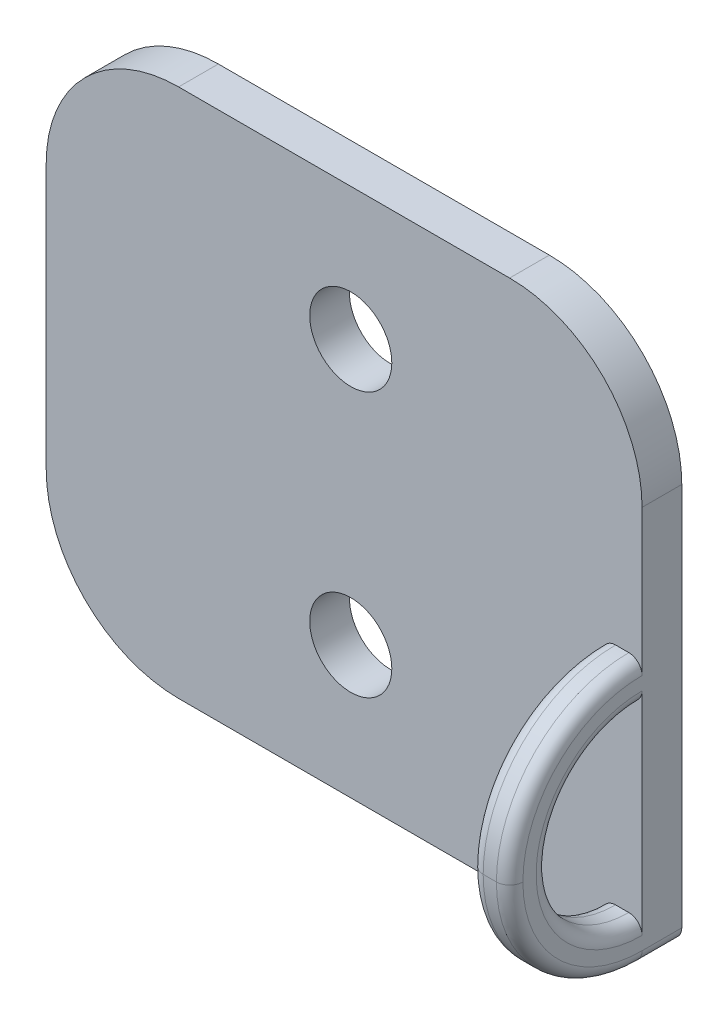
ISO-10303-21;
HEADER;
FILE_DESCRIPTION(('STEP AP214'),'2;1');
FILE_NAME('part.step','',(''),(''),'','','');
FILE_SCHEMA(('AUTOMOTIVE_DESIGN { 1 0 10303 214 1 1 1 1 }'));
ENDSEC;
DATA;
#1=APPLICATION_CONTEXT('core data for automotive mechanical design processes');
#2=APPLICATION_PROTOCOL_DEFINITION('international standard','automotive_design',2000,#1);
#3=PRODUCT_CONTEXT('',#1,'mechanical');
#4=PRODUCT('Part','Part','',(#3));
#5=PRODUCT_RELATED_PRODUCT_CATEGORY('part','',(#4));
#6=PRODUCT_DEFINITION_FORMATION('','',#4);
#7=PRODUCT_DEFINITION_CONTEXT('part definition',#1,'design');
#8=PRODUCT_DEFINITION('design','',#6,#7);
#9=PRODUCT_DEFINITION_SHAPE('','',#8);
#10=(LENGTH_UNIT() NAMED_UNIT(*) SI_UNIT(.MILLI.,.METRE.));
#11=(NAMED_UNIT(*) PLANE_ANGLE_UNIT() SI_UNIT($,.RADIAN.));
#12=(NAMED_UNIT(*) SI_UNIT($,.STERADIAN.) SOLID_ANGLE_UNIT());
#13=UNCERTAINTY_MEASURE_WITH_UNIT(LENGTH_MEASURE(1.E-05),#10,'distance_accuracy_value','');
#14=(GEOMETRIC_REPRESENTATION_CONTEXT(3) GLOBAL_UNCERTAINTY_ASSIGNED_CONTEXT((#13)) GLOBAL_UNIT_ASSIGNED_CONTEXT((#10,
#11,#12)) REPRESENTATION_CONTEXT('',''));
#15=CARTESIAN_POINT('',(0.,0.,0.));
#16=DIRECTION('',(0.,0.,1.));
#17=DIRECTION('',(1.,0.,0.));
#18=AXIS2_PLACEMENT_3D('',#15,#16,#17);
#19=CARTESIAN_POINT('',(35.,30.,3.));
#20=DIRECTION('',(0.,0.,-1.));
#21=DIRECTION('',(-1.,0.,0.));
#22=AXIS2_PLACEMENT_3D('',#19,#20,#21);
#23=PLANE('',#22);
#24=CARTESIAN_POINT('',(23.,10.,3.));
#25=DIRECTION('',(0.,0.,1.));
#26=DIRECTION('',(1.,0.,0.));
#27=AXIS2_PLACEMENT_3D('',#24,#25,#26);
#28=CIRCLE('',#27,3.1);
#29=CARTESIAN_POINT('',(26.1,10.,3.));
#30=VERTEX_POINT('',#29);
#31=EDGE_CURVE('E256',#30,#30,#28,.T.);
#32=ORIENTED_EDGE('',*,*,#31,.F.);
#33=EDGE_LOOP('',(#32));
#34=FACE_BOUND('',#33,.T.);
#35=CARTESIAN_POINT('',(23.,30.,3.));
#36=DIRECTION('',(0.,0.,1.));
#37=DIRECTION('',(1.,0.,0.));
#38=AXIS2_PLACEMENT_3D('',#35,#36,#37);
#39=CIRCLE('',#38,3.1);
#40=CARTESIAN_POINT('',(26.1,30.,3.));
#41=VERTEX_POINT('',#40);
#42=EDGE_CURVE('E263',#41,#41,#39,.T.);
#43=ORIENTED_EDGE('',*,*,#42,.F.);
#44=EDGE_LOOP('',(#43));
#45=FACE_BOUND('',#44,.T.);
#46=DIRECTION('',(0.,-1.,0.));
#47=VECTOR('',#46,1.);
#48=CARTESIAN_POINT('',(42.,0.,3.));
#49=LINE('',#48,#47);
#50=CARTESIAN_POINT('',(42.,19.,3.));
#51=VERTEX_POINT('',#50);
#52=CARTESIAN_POINT('',(42.,18.,3.));
#53=VERTEX_POINT('',#52);
#54=EDGE_CURVE('E255',#51,#53,#49,.T.);
#55=ORIENTED_EDGE('',*,*,#54,.F.);
#56=CARTESIAN_POINT('',(43.,19.,3.));
#57=DIRECTION('',(0.,0.,-1.));
#58=DIRECTION('',(-1.,0.,0.));
#59=AXIS2_PLACEMENT_3D('',#56,#57,#58);
#60=CIRCLE('',#59,1.);
#61=CARTESIAN_POINT('',(43.,20.,3.));
#62=VERTEX_POINT('',#61);
#63=EDGE_CURVE('E55',#51,#62,#60,.T.);
#64=ORIENTED_EDGE('',*,*,#63,.T.);
#65=DIRECTION('',(-1.,0.,0.));
#66=VECTOR('',#65,1.);
#67=CARTESIAN_POINT('',(45.,20.,3.));
#68=LINE('',#67,#66);
#69=CARTESIAN_POINT('',(44.,20.,3.));
#70=VERTEX_POINT('',#69);
#71=EDGE_CURVE('E189',#70,#62,#68,.T.);
#72=ORIENTED_EDGE('',*,*,#71,.F.);
#73=CARTESIAN_POINT('',(44.,19.,3.));
#74=DIRECTION('',(0.,0.,-1.));
#75=DIRECTION('',(-1.,0.,0.));
#76=AXIS2_PLACEMENT_3D('',#73,#74,#75);
#77=CIRCLE('',#76,1.);
#78=CARTESIAN_POINT('',(45.,19.,3.));
#79=VERTEX_POINT('',#78);
#80=EDGE_CURVE('E157',#70,#79,#77,.T.);
#81=ORIENTED_EDGE('',*,*,#80,.T.);
#82=DIRECTION('',(0.,1.,0.));
#83=VECTOR('',#82,1.);
#84=CARTESIAN_POINT('',(45.,0.,3.));
#85=LINE('',#84,#83);
#86=CARTESIAN_POINT('',(45.,29.9999999999999,3.));
#87=VERTEX_POINT('',#86);
#88=EDGE_CURVE('E152',#79,#87,#85,.T.);
#89=ORIENTED_EDGE('',*,*,#88,.T.);
#90=CARTESIAN_POINT('',(35.,30.,3.));
#91=DIRECTION('',(0.,0.,1.));
#92=DIRECTION('',(-1.,0.,0.));
#93=AXIS2_PLACEMENT_3D('',#90,#91,#92);
#94=CIRCLE('',#93,10.);
#95=CARTESIAN_POINT('',(34.9999999999999,40.,3.));
#96=VERTEX_POINT('',#95);
#97=EDGE_CURVE('E154',#87,#96,#94,.T.);
#98=ORIENTED_EDGE('',*,*,#97,.T.);
#99=DIRECTION('',(-1.,0.,0.));
#100=VECTOR('',#99,1.);
#101=CARTESIAN_POINT('',(10.0000000000001,40.,3.));
#102=LINE('',#101,#100);
#103=CARTESIAN_POINT('',(10.0000000000001,40.,3.));
#104=VERTEX_POINT('',#103);
#105=EDGE_CURVE('E170',#96,#104,#102,.T.);
#106=ORIENTED_EDGE('',*,*,#105,.T.);
#107=CARTESIAN_POINT('',(10.,30.,3.));
#108=DIRECTION('',(0.,0.,1.));
#109=DIRECTION('',(-1.,0.,0.));
#110=AXIS2_PLACEMENT_3D('',#107,#108,#109);
#111=CIRCLE('',#110,10.);
#112=CARTESIAN_POINT('',(0.,29.9999999999999,3.));
#113=VERTEX_POINT('',#112);
#114=EDGE_CURVE('E269',#104,#113,#111,.T.);
#115=ORIENTED_EDGE('',*,*,#114,.T.);
#116=DIRECTION('',(0.,-1.,0.));
#117=VECTOR('',#116,1.);
#118=CARTESIAN_POINT('',(0.,10.0000000000001,3.));
#119=LINE('',#118,#117);
#120=CARTESIAN_POINT('',(0.,10.,3.));
#121=VERTEX_POINT('',#120);
#122=EDGE_CURVE('E271',#113,#121,#119,.T.);
#123=ORIENTED_EDGE('',*,*,#122,.T.);
#124=CARTESIAN_POINT('',(10.,10.,3.));
#125=DIRECTION('',(0.,0.,1.));
#126=DIRECTION('',(-1.,0.,0.));
#127=AXIS2_PLACEMENT_3D('',#124,#125,#126);
#128=CIRCLE('',#127,10.);
#129=CARTESIAN_POINT('',(10.0000000000001,0.,3.));
#130=VERTEX_POINT('',#129);
#131=EDGE_CURVE('E273',#121,#130,#128,.T.);
#132=ORIENTED_EDGE('',*,*,#131,.T.);
#133=DIRECTION('',(1.,0.,0.));
#134=VECTOR('',#133,1.);
#135=CARTESIAN_POINT('',(10.0000000000001,0.,3.));
#136=LINE('',#135,#134);
#137=CARTESIAN_POINT('',(43.,0.,3.));
#138=VERTEX_POINT('',#137);
#139=EDGE_CURVE('E275',#130,#138,#136,.T.);
#140=ORIENTED_EDGE('',*,*,#139,.T.);
#141=CARTESIAN_POINT('',(43.,0.999999999999999,3.));
#142=DIRECTION('',(0.,0.,-1.));
#143=DIRECTION('',(-1.,0.,0.));
#144=AXIS2_PLACEMENT_3D('',#141,#142,#143);
#145=CIRCLE('',#144,1.);
#146=CARTESIAN_POINT('',(42.,0.999999999999999,3.));
#147=VERTEX_POINT('',#146);
#148=EDGE_CURVE('E224',#138,#147,#145,.T.);
#149=ORIENTED_EDGE('',*,*,#148,.T.);
#150=CARTESIAN_POINT('',(42.,2.,3.));
#151=VERTEX_POINT('',#150);
#152=EDGE_CURVE('E252',#151,#147,#49,.T.);
#153=ORIENTED_EDGE('',*,*,#152,.F.);
#154=CARTESIAN_POINT('',(43.,2.,3.));
#155=DIRECTION('',(0.,0.,-1.));
#156=DIRECTION('',(-1.,0.,0.));
#157=AXIS2_PLACEMENT_3D('',#154,#155,#156);
#158=CIRCLE('',#157,1.);
#159=CARTESIAN_POINT('',(43.,3.,3.));
#160=VERTEX_POINT('',#159);
#161=EDGE_CURVE('E11',#151,#160,#158,.T.);
#162=ORIENTED_EDGE('',*,*,#161,.T.);
#163=DIRECTION('',(-1.,0.,0.));
#164=VECTOR('',#163,1.);
#165=CARTESIAN_POINT('',(45.,3.,3.));
#166=LINE('',#165,#164);
#167=CARTESIAN_POINT('',(44.,3.,3.));
#168=VERTEX_POINT('',#167);
#169=EDGE_CURVE('E190',#168,#160,#166,.T.);
#170=ORIENTED_EDGE('',*,*,#169,.F.);
#171=CARTESIAN_POINT('',(44.,2.,3.));
#172=DIRECTION('',(0.,0.,-1.));
#173=DIRECTION('',(-1.,0.,0.));
#174=AXIS2_PLACEMENT_3D('',#171,#172,#173);
#175=CIRCLE('',#174,1.);
#176=CARTESIAN_POINT('',(45.,2.,3.));
#177=VERTEX_POINT('',#176);
#178=EDGE_CURVE('E228',#168,#177,#175,.T.);
#179=ORIENTED_EDGE('',*,*,#178,.T.);
#180=DIRECTION('',(0.,-1.,0.));
#181=VECTOR('',#180,1.);
#182=CARTESIAN_POINT('',(45.,17.,3.));
#183=LINE('',#182,#181);
#184=CARTESIAN_POINT('',(45.,18.,3.));
#185=VERTEX_POINT('',#184);
#186=EDGE_CURVE('E238',#185,#177,#183,.T.);
#187=ORIENTED_EDGE('',*,*,#186,.F.);
#188=CARTESIAN_POINT('',(44.,18.,3.));
#189=DIRECTION('',(0.,0.,-1.));
#190=DIRECTION('',(-1.,0.,0.));
#191=AXIS2_PLACEMENT_3D('',#188,#189,#190);
#192=CIRCLE('',#191,1.);
#193=CARTESIAN_POINT('',(44.,17.,3.));
#194=VERTEX_POINT('',#193);
#195=EDGE_CURVE('E226',#185,#194,#192,.T.);
#196=ORIENTED_EDGE('',*,*,#195,.T.);
#197=DIRECTION('',(-1.,0.,0.));
#198=VECTOR('',#197,1.);
#199=CARTESIAN_POINT('',(45.,17.,3.));
#200=LINE('',#199,#198);
#201=CARTESIAN_POINT('',(43.,17.,3.));
#202=VERTEX_POINT('',#201);
#203=EDGE_CURVE('E243',#194,#202,#200,.T.);
#204=ORIENTED_EDGE('',*,*,#203,.T.);
#205=CARTESIAN_POINT('',(43.,18.,3.));
#206=DIRECTION('',(0.,0.,-1.));
#207=DIRECTION('',(-1.,0.,0.));
#208=AXIS2_PLACEMENT_3D('',#205,#206,#207);
#209=CIRCLE('',#208,1.);
#210=EDGE_CURVE('E47',#202,#53,#209,.T.);
#211=ORIENTED_EDGE('',*,*,#210,.T.);
#212=EDGE_LOOP('',(#55,#64,#72,#81,#89,#98,#106,#115,#123,#132,#140,#149,#153,#162,#170,#179,
#187,#196,#204,#211));
#213=FACE_BOUND('',#212,.T.);
#214=ADVANCED_FACE('F37',(#34,#45,#213),#23,.F.);
#215=CARTESIAN_POINT('',(35.,30.,0.));
#216=DIRECTION('',(0.,0.,-1.));
#217=DIRECTION('',(-1.,0.,0.));
#218=AXIS2_PLACEMENT_3D('',#215,#216,#217);
#219=PLANE('',#218);
#220=CARTESIAN_POINT('',(23.,30.,0.));
#221=DIRECTION('',(0.,0.,1.));
#222=DIRECTION('',(1.,0.,0.));
#223=AXIS2_PLACEMENT_3D('',#220,#221,#222);
#224=CIRCLE('',#223,3.1);
#225=CARTESIAN_POINT('',(26.1,30.,0.));
#226=VERTEX_POINT('',#225);
#227=EDGE_CURVE('E259',#226,#226,#224,.T.);
#228=ORIENTED_EDGE('',*,*,#227,.T.);
#229=EDGE_LOOP('',(#228));
#230=FACE_BOUND('',#229,.T.);
#231=DIRECTION('',(0.,1.,0.));
#232=VECTOR('',#231,1.);
#233=CARTESIAN_POINT('',(45.,0.,0.));
#234=LINE('',#233,#232);
#235=CARTESIAN_POINT('',(45.,1.,0.));
#236=VERTEX_POINT('',#235);
#237=CARTESIAN_POINT('',(45.,29.9999999999999,0.));
#238=VERTEX_POINT('',#237);
#239=EDGE_CURVE('E175',#236,#238,#234,.T.);
#240=ORIENTED_EDGE('',*,*,#239,.F.);
#241=CARTESIAN_POINT('',(44.,1.,0.));
#242=DIRECTION('',(0.,0.,-1.));
#243=DIRECTION('',(-1.,0.,0.));
#244=AXIS2_PLACEMENT_3D('',#241,#242,#243);
#245=CIRCLE('',#244,1.);
#246=CARTESIAN_POINT('',(44.,0.,0.));
#247=VERTEX_POINT('',#246);
#248=EDGE_CURVE('E199',#236,#247,#245,.T.);
#249=ORIENTED_EDGE('',*,*,#248,.T.);
#250=DIRECTION('',(1.,0.,0.));
#251=VECTOR('',#250,1.);
#252=CARTESIAN_POINT('',(10.0000000000001,0.,0.));
#253=LINE('',#252,#251);
#254=CARTESIAN_POINT('',(10.0000000000001,0.,0.));
#255=VERTEX_POINT('',#254);
#256=EDGE_CURVE('E161',#255,#247,#253,.T.);
#257=ORIENTED_EDGE('',*,*,#256,.F.);
#258=CARTESIAN_POINT('',(10.,10.,0.));
#259=DIRECTION('',(0.,0.,1.));
#260=DIRECTION('',(-1.,0.,0.));
#261=AXIS2_PLACEMENT_3D('',#258,#259,#260);
#262=CIRCLE('',#261,10.);
#263=CARTESIAN_POINT('',(0.,10.,0.));
#264=VERTEX_POINT('',#263);
#265=EDGE_CURVE('E288',#264,#255,#262,.T.);
#266=ORIENTED_EDGE('',*,*,#265,.F.);
#267=DIRECTION('',(0.,-1.,0.));
#268=VECTOR('',#267,1.);
#269=CARTESIAN_POINT('',(0.,10.0000000000001,0.));
#270=LINE('',#269,#268);
#271=CARTESIAN_POINT('',(0.,29.9999999999999,0.));
#272=VERTEX_POINT('',#271);
#273=EDGE_CURVE('E286',#272,#264,#270,.T.);
#274=ORIENTED_EDGE('',*,*,#273,.F.);
#275=CARTESIAN_POINT('',(10.,30.,0.));
#276=DIRECTION('',(0.,0.,1.));
#277=DIRECTION('',(-1.,0.,0.));
#278=AXIS2_PLACEMENT_3D('',#275,#276,#277);
#279=CIRCLE('',#278,10.);
#280=CARTESIAN_POINT('',(10.0000000000001,40.,0.));
#281=VERTEX_POINT('',#280);
#282=EDGE_CURVE('E284',#281,#272,#279,.T.);
#283=ORIENTED_EDGE('',*,*,#282,.F.);
#284=DIRECTION('',(-1.,0.,0.));
#285=VECTOR('',#284,1.);
#286=CARTESIAN_POINT('',(10.0000000000001,40.,0.));
#287=LINE('',#286,#285);
#288=CARTESIAN_POINT('',(34.9999999999999,40.,0.));
#289=VERTEX_POINT('',#288);
#290=EDGE_CURVE('E282',#289,#281,#287,.T.);
#291=ORIENTED_EDGE('',*,*,#290,.F.);
#292=CARTESIAN_POINT('',(35.,30.,0.));
#293=DIRECTION('',(0.,0.,1.));
#294=DIRECTION('',(-1.,0.,0.));
#295=AXIS2_PLACEMENT_3D('',#292,#293,#294);
#296=CIRCLE('',#295,10.);
#297=EDGE_CURVE('E280',#238,#289,#296,.T.);
#298=ORIENTED_EDGE('',*,*,#297,.F.);
#299=EDGE_LOOP('',(#240,#249,#257,#266,#274,#283,#291,#298));
#300=FACE_BOUND('',#299,.T.);
#301=CARTESIAN_POINT('',(23.,10.,0.));
#302=DIRECTION('',(0.,0.,1.));
#303=DIRECTION('',(1.,0.,0.));
#304=AXIS2_PLACEMENT_3D('',#301,#302,#303);
#305=CIRCLE('',#304,3.1);
#306=CARTESIAN_POINT('',(26.1,10.,0.));
#307=VERTEX_POINT('',#306);
#308=EDGE_CURVE('E260',#307,#307,#305,.T.);
#309=ORIENTED_EDGE('',*,*,#308,.T.);
#310=EDGE_LOOP('',(#309));
#311=FACE_BOUND('',#310,.T.);
#312=ADVANCED_FACE('F310',(#230,#300,#311),#219,.T.);
#313=CARTESIAN_POINT('',(45.,0.,3.));
#314=DIRECTION('',(-1.,0.,0.));
#315=DIRECTION('',(0.,0.,1.));
#316=AXIS2_PLACEMENT_3D('',#313,#314,#315);
#317=PLANE('',#316);
#318=CARTESIAN_POINT('',(45.,10.,3.));
#319=DIRECTION('',(-1.,0.,0.));
#320=DIRECTION('',(0.,0.,1.));
#321=AXIS2_PLACEMENT_3D('',#318,#319,#320);
#322=CIRCLE('',#321,8.);
#323=EDGE_CURVE('E196',#177,#185,#322,.T.);
#324=ORIENTED_EDGE('',*,*,#323,.T.);
#325=ORIENTED_EDGE('',*,*,#186,.T.);
#326=EDGE_LOOP('',(#324,#325));
#327=FACE_BOUND('',#326,.T.);
#328=CARTESIAN_POINT('',(45.,10.,3.));
#329=DIRECTION('',(-1.,0.,0.));
#330=DIRECTION('',(0.,0.,1.));
#331=AXIS2_PLACEMENT_3D('',#328,#329,#330);
#332=CIRCLE('',#331,9.);
#333=CARTESIAN_POINT('',(45.,10.,12.));
#334=VERTEX_POINT('',#333);
#335=CARTESIAN_POINT('',(45.,1.,3.));
#336=VERTEX_POINT('',#335);
#337=EDGE_CURVE('E192',#334,#336,#332,.F.);
#338=ORIENTED_EDGE('',*,*,#337,.T.);
#339=DIRECTION('',(0.,0.,-1.));
#340=VECTOR('',#339,1.);
#341=CARTESIAN_POINT('',(45.,1.,3.));
#342=LINE('',#341,#340);
#343=EDGE_CURVE('E194',#336,#236,#342,.T.);
#344=ORIENTED_EDGE('',*,*,#343,.T.);
#345=ORIENTED_EDGE('',*,*,#239,.T.);
#346=DIRECTION('',(0.,0.,-1.));
#347=VECTOR('',#346,1.);
#348=CARTESIAN_POINT('',(45.,29.9999999999999,3.));
#349=LINE('',#348,#347);
#350=EDGE_CURVE('E166',#87,#238,#349,.T.);
#351=ORIENTED_EDGE('',*,*,#350,.F.);
#352=ORIENTED_EDGE('',*,*,#88,.F.);
#353=CARTESIAN_POINT('',(45.,10.,3.));
#354=DIRECTION('',(-1.,0.,0.));
#355=DIRECTION('',(0.,0.,1.));
#356=AXIS2_PLACEMENT_3D('',#353,#354,#355);
#357=CIRCLE('',#356,9.);
#358=EDGE_CURVE('E180',#79,#334,#357,.F.);
#359=ORIENTED_EDGE('',*,*,#358,.T.);
#360=EDGE_LOOP('',(#338,#344,#345,#351,#352,#359));
#361=FACE_BOUND('',#360,.T.);
#362=ADVANCED_FACE('F172',(#327,#361),#317,.F.);
#363=CARTESIAN_POINT('',(35.,30.,3.));
#364=DIRECTION('',(0.,0.,-1.));
#365=DIRECTION('',(-1.,0.,0.));
#366=AXIS2_PLACEMENT_3D('',#363,#364,#365);
#367=CYLINDRICAL_SURFACE('',#366,10.);
#368=ORIENTED_EDGE('',*,*,#297,.T.);
#369=DIRECTION('',(0.,0.,-1.));
#370=VECTOR('',#369,1.);
#371=CARTESIAN_POINT('',(34.9999999999999,40.,3.));
#372=LINE('',#371,#370);
#373=EDGE_CURVE('E168',#96,#289,#372,.T.);
#374=ORIENTED_EDGE('',*,*,#373,.F.);
#375=ORIENTED_EDGE('',*,*,#97,.F.);
#376=ORIENTED_EDGE('',*,*,#350,.T.);
#377=EDGE_LOOP('',(#368,#374,#375,#376));
#378=FACE_BOUND('',#377,.T.);
#379=ADVANCED_FACE('F165',(#378),#367,.T.);
#380=CARTESIAN_POINT('',(10.0000000000001,40.,3.));
#381=DIRECTION('',(0.,-1.,0.));
#382=DIRECTION('',(0.,0.,-1.));
#383=AXIS2_PLACEMENT_3D('',#380,#381,#382);
#384=PLANE('',#383);
#385=ORIENTED_EDGE('',*,*,#290,.T.);
#386=DIRECTION('',(0.,0.,-1.));
#387=VECTOR('',#386,1.);
#388=CARTESIAN_POINT('',(10.0000000000001,40.,3.));
#389=LINE('',#388,#387);
#390=EDGE_CURVE('E182',#104,#281,#389,.T.);
#391=ORIENTED_EDGE('',*,*,#390,.F.);
#392=ORIENTED_EDGE('',*,*,#105,.F.);
#393=ORIENTED_EDGE('',*,*,#373,.T.);
#394=EDGE_LOOP('',(#385,#391,#392,#393));
#395=FACE_BOUND('',#394,.T.);
#396=ADVANCED_FACE('F323',(#395),#384,.F.);
#397=CARTESIAN_POINT('',(10.,30.,3.));
#398=DIRECTION('',(0.,0.,-1.));
#399=DIRECTION('',(-1.,0.,0.));
#400=AXIS2_PLACEMENT_3D('',#397,#398,#399);
#401=CYLINDRICAL_SURFACE('',#400,10.);
#402=ORIENTED_EDGE('',*,*,#282,.T.);
#403=DIRECTION('',(0.,0.,-1.));
#404=VECTOR('',#403,1.);
#405=CARTESIAN_POINT('',(0.,29.9999999999999,3.));
#406=LINE('',#405,#404);
#407=EDGE_CURVE('E297',#113,#272,#406,.T.);
#408=ORIENTED_EDGE('',*,*,#407,.F.);
#409=ORIENTED_EDGE('',*,*,#114,.F.);
#410=ORIENTED_EDGE('',*,*,#390,.T.);
#411=EDGE_LOOP('',(#402,#408,#409,#410));
#412=FACE_BOUND('',#411,.T.);
#413=ADVANCED_FACE('F304',(#412),#401,.T.);
#414=CARTESIAN_POINT('',(0.,10.0000000000001,3.));
#415=DIRECTION('',(1.,0.,0.));
#416=DIRECTION('',(0.,0.,-1.));
#417=AXIS2_PLACEMENT_3D('',#414,#415,#416);
#418=PLANE('',#417);
#419=ORIENTED_EDGE('',*,*,#273,.T.);
#420=DIRECTION('',(0.,0.,-1.));
#421=VECTOR('',#420,1.);
#422=CARTESIAN_POINT('',(0.,10.,3.));
#423=LINE('',#422,#421);
#424=EDGE_CURVE('E294',#121,#264,#423,.T.);
#425=ORIENTED_EDGE('',*,*,#424,.F.);
#426=ORIENTED_EDGE('',*,*,#122,.F.);
#427=ORIENTED_EDGE('',*,*,#407,.T.);
#428=EDGE_LOOP('',(#419,#425,#426,#427));
#429=FACE_BOUND('',#428,.T.);
#430=ADVANCED_FACE('F316',(#429),#418,.F.);
#431=CARTESIAN_POINT('',(10.,10.,3.));
#432=DIRECTION('',(0.,0.,-1.));
#433=DIRECTION('',(-1.,0.,0.));
#434=AXIS2_PLACEMENT_3D('',#431,#432,#433);
#435=CYLINDRICAL_SURFACE('',#434,10.);
#436=ORIENTED_EDGE('',*,*,#265,.T.);
#437=DIRECTION('',(0.,0.,-1.));
#438=VECTOR('',#437,1.);
#439=CARTESIAN_POINT('',(10.0000000000001,0.,3.));
#440=LINE('',#439,#438);
#441=EDGE_CURVE('E278',#130,#255,#440,.T.);
#442=ORIENTED_EDGE('',*,*,#441,.F.);
#443=ORIENTED_EDGE('',*,*,#131,.F.);
#444=ORIENTED_EDGE('',*,*,#424,.T.);
#445=EDGE_LOOP('',(#436,#442,#443,#444));
#446=FACE_BOUND('',#445,.T.);
#447=ADVANCED_FACE('F320',(#446),#435,.T.);
#448=CARTESIAN_POINT('',(10.0000000000001,0.,3.));
#449=DIRECTION('',(0.,1.,0.));
#450=DIRECTION('',(0.,0.,1.));
#451=AXIS2_PLACEMENT_3D('',#448,#449,#450);
#452=PLANE('',#451);
#453=ORIENTED_EDGE('',*,*,#256,.T.);
#454=DIRECTION('',(0.,0.,-1.));
#455=VECTOR('',#454,1.);
#456=CARTESIAN_POINT('',(44.,0.,3.));
#457=LINE('',#456,#455);
#458=CARTESIAN_POINT('',(44.,0.,3.));
#459=VERTEX_POINT('',#458);
#460=EDGE_CURVE('E201',#247,#459,#457,.F.);
#461=ORIENTED_EDGE('',*,*,#460,.T.);
#462=DIRECTION('',(1.,0.,0.));
#463=VECTOR('',#462,1.);
#464=CARTESIAN_POINT('',(42.,0.,3.));
#465=LINE('',#464,#463);
#466=EDGE_CURVE('E177',#459,#138,#465,.F.);
#467=ORIENTED_EDGE('',*,*,#466,.T.);
#468=ORIENTED_EDGE('',*,*,#139,.F.);
#469=ORIENTED_EDGE('',*,*,#441,.T.);
#470=EDGE_LOOP('',(#453,#461,#467,#468,#469));
#471=FACE_BOUND('',#470,.T.);
#472=ADVANCED_FACE('F346',(#471),#452,.F.);
#473=CARTESIAN_POINT('',(23.,30.,3.));
#474=DIRECTION('',(0.,0.,-1.));
#475=DIRECTION('',(-1.,0.,0.));
#476=AXIS2_PLACEMENT_3D('',#473,#474,#475);
#477=CYLINDRICAL_SURFACE('',#476,3.1);
#478=ORIENTED_EDGE('',*,*,#42,.T.);
#479=EDGE_LOOP('',(#478));
#480=FACE_BOUND('',#479,.T.);
#481=ORIENTED_EDGE('',*,*,#227,.F.);
#482=EDGE_LOOP('',(#481));
#483=FACE_BOUND('',#482,.T.);
#484=ADVANCED_FACE('F343',(#480,#483),#477,.F.);
#485=CARTESIAN_POINT('',(23.,10.,3.));
#486=DIRECTION('',(0.,0.,-1.));
#487=DIRECTION('',(-1.,0.,0.));
#488=AXIS2_PLACEMENT_3D('',#485,#486,#487);
#489=CYLINDRICAL_SURFACE('',#488,3.1);
#490=ORIENTED_EDGE('',*,*,#31,.T.);
#491=EDGE_LOOP('',(#490));
#492=FACE_BOUND('',#491,.T.);
#493=ORIENTED_EDGE('',*,*,#308,.F.);
#494=EDGE_LOOP('',(#493));
#495=FACE_BOUND('',#494,.T.);
#496=ADVANCED_FACE('F373',(#492,#495),#489,.F.);
#497=CARTESIAN_POINT('',(42.,0.,13.));
#498=DIRECTION('',(1.,0.,0.));
#499=DIRECTION('',(0.,0.,-1.));
#500=AXIS2_PLACEMENT_3D('',#497,#498,#499);
#501=PLANE('',#500);
#502=ORIENTED_EDGE('',*,*,#152,.T.);
#503=CARTESIAN_POINT('',(42.,10.,3.));
#504=DIRECTION('',(1.,0.,0.));
#505=DIRECTION('',(0.,0.,-1.));
#506=AXIS2_PLACEMENT_3D('',#503,#504,#505);
#507=CIRCLE('',#506,9.);
#508=CARTESIAN_POINT('',(42.,10.,12.));
#509=VERTEX_POINT('',#508);
#510=EDGE_CURVE('E212',#147,#509,#507,.F.);
#511=ORIENTED_EDGE('',*,*,#510,.T.);
#512=CARTESIAN_POINT('',(42.,10.,3.));
#513=DIRECTION('',(1.,0.,0.));
#514=DIRECTION('',(0.,0.,-1.));
#515=AXIS2_PLACEMENT_3D('',#512,#513,#514);
#516=CIRCLE('',#515,9.);
#517=EDGE_CURVE('E210',#509,#51,#516,.F.);
#518=ORIENTED_EDGE('',*,*,#517,.T.);
#519=ORIENTED_EDGE('',*,*,#54,.T.);
#520=CARTESIAN_POINT('',(42.,10.,3.));
#521=DIRECTION('',(1.,0.,0.));
#522=DIRECTION('',(0.,0.,-1.));
#523=AXIS2_PLACEMENT_3D('',#520,#521,#522);
#524=CIRCLE('',#523,8.);
#525=EDGE_CURVE('E208',#53,#151,#524,.T.);
#526=ORIENTED_EDGE('',*,*,#525,.T.);
#527=EDGE_LOOP('',(#502,#511,#518,#519,#526));
#528=FACE_BOUND('',#527,.T.);
#529=ADVANCED_FACE('F380',(#528),#501,.F.);
#530=CARTESIAN_POINT('',(0.,10.,3.));
#531=DIRECTION('',(1.,0.,0.));
#532=DIRECTION('',(0.,0.,-1.));
#533=AXIS2_PLACEMENT_3D('',#530,#531,#532);
#534=CYLINDRICAL_SURFACE('',#533,10.);
#535=DIRECTION('',(-1.,0.,0.));
#536=VECTOR('',#535,1.);
#537=CARTESIAN_POINT('',(42.,10.,13.));
#538=LINE('',#537,#536);
#539=CARTESIAN_POINT('',(44.,10.,13.));
#540=VERTEX_POINT('',#539);
#541=CARTESIAN_POINT('',(43.,10.,13.));
#542=VERTEX_POINT('',#541);
#543=EDGE_CURVE('E186',#540,#542,#538,.T.);
#544=ORIENTED_EDGE('',*,*,#543,.F.);
#545=CARTESIAN_POINT('',(44.,10.,3.));
#546=DIRECTION('',(-1.,0.,0.));
#547=DIRECTION('',(0.,0.,1.));
#548=AXIS2_PLACEMENT_3D('',#545,#546,#547);
#549=CIRCLE('',#548,10.);
#550=EDGE_CURVE('E222',#540,#70,#549,.T.);
#551=ORIENTED_EDGE('',*,*,#550,.T.);
#552=ORIENTED_EDGE('',*,*,#71,.T.);
#553=CARTESIAN_POINT('',(43.,10.,3.));
#554=DIRECTION('',(1.,0.,0.));
#555=DIRECTION('',(0.,0.,-1.));
#556=AXIS2_PLACEMENT_3D('',#553,#554,#555);
#557=CIRCLE('',#556,10.);
#558=EDGE_CURVE('E220',#62,#542,#557,.T.);
#559=ORIENTED_EDGE('',*,*,#558,.T.);
#560=EDGE_LOOP('',(#544,#551,#552,#559));
#561=FACE_BOUND('',#560,.T.);
#562=ADVANCED_FACE('F386',(#561),#534,.T.);
#563=CARTESIAN_POINT('',(0.,10.,3.));
#564=DIRECTION('',(-1.,0.,0.));
#565=DIRECTION('',(0.,0.,1.));
#566=AXIS2_PLACEMENT_3D('',#563,#564,#565);
#567=CYLINDRICAL_SURFACE('',#566,10.);
#568=ORIENTED_EDGE('',*,*,#466,.F.);
#569=CARTESIAN_POINT('',(44.,10.,3.));
#570=DIRECTION('',(-1.,0.,0.));
#571=DIRECTION('',(0.,0.,1.));
#572=AXIS2_PLACEMENT_3D('',#569,#570,#571);
#573=CIRCLE('',#572,10.);
#574=EDGE_CURVE('E206',#459,#540,#573,.T.);
#575=ORIENTED_EDGE('',*,*,#574,.T.);
#576=ORIENTED_EDGE('',*,*,#543,.T.);
#577=CARTESIAN_POINT('',(43.,10.,3.));
#578=DIRECTION('',(1.,0.,0.));
#579=DIRECTION('',(0.,0.,-1.));
#580=AXIS2_PLACEMENT_3D('',#577,#578,#579);
#581=CIRCLE('',#580,10.);
#582=EDGE_CURVE('E203',#542,#138,#581,.T.);
#583=ORIENTED_EDGE('',*,*,#582,.T.);
#584=EDGE_LOOP('',(#568,#575,#576,#583));
#585=FACE_BOUND('',#584,.T.);
#586=ADVANCED_FACE('F394',(#585),#567,.T.);
#587=CARTESIAN_POINT('',(45.,10.,3.));
#588=DIRECTION('',(-1.,0.,0.));
#589=DIRECTION('',(0.,0.,1.));
#590=AXIS2_PLACEMENT_3D('',#587,#588,#589);
#591=CYLINDRICAL_SURFACE('',#590,7.);
#592=ORIENTED_EDGE('',*,*,#203,.F.);
#593=CARTESIAN_POINT('',(44.,10.,3.));
#594=DIRECTION('',(-1.,0.,0.));
#595=DIRECTION('',(0.,0.,1.));
#596=AXIS2_PLACEMENT_3D('',#593,#594,#595);
#597=CIRCLE('',#596,7.);
#598=EDGE_CURVE('E218',#194,#168,#597,.F.);
#599=ORIENTED_EDGE('',*,*,#598,.T.);
#600=ORIENTED_EDGE('',*,*,#169,.T.);
#601=CARTESIAN_POINT('',(43.,10.,3.));
#602=DIRECTION('',(1.,0.,0.));
#603=DIRECTION('',(0.,0.,-1.));
#604=AXIS2_PLACEMENT_3D('',#601,#602,#603);
#605=CIRCLE('',#604,7.);
#606=EDGE_CURVE('E215',#160,#202,#605,.F.);
#607=ORIENTED_EDGE('',*,*,#606,.T.);
#608=EDGE_LOOP('',(#592,#599,#600,#607));
#609=FACE_BOUND('',#608,.T.);
#610=ADVANCED_FACE('F402',(#609),#591,.F.);
#611=CARTESIAN_POINT('',(44.,10.,3.));
#612=DIRECTION('',(-1.,0.,0.));
#613=DIRECTION('',(0.,0.,1.));
#614=AXIS2_PLACEMENT_3D('',#611,#612,#613);
#615=TOROIDAL_SURFACE('',#614,9.,1.);
#616=ORIENTED_EDGE('',*,*,#80,.F.);
#617=ORIENTED_EDGE('',*,*,#550,.F.);
#618=CARTESIAN_POINT('',(44.,10.,12.));
#619=DIRECTION('',(0.,-1.,0.));
#620=DIRECTION('',(0.,0.,-1.));
#621=AXIS2_PLACEMENT_3D('',#618,#619,#620);
#622=CIRCLE('',#621,1.);
#623=EDGE_CURVE('E236',#334,#540,#622,.T.);
#624=ORIENTED_EDGE('',*,*,#623,.F.);
#625=ORIENTED_EDGE('',*,*,#358,.F.);
#626=EDGE_LOOP('',(#616,#617,#624,#625));
#627=FACE_BOUND('',#626,.T.);
#628=ADVANCED_FACE('F410',(#627),#615,.T.);
#629=CARTESIAN_POINT('',(44.,10.,3.));
#630=DIRECTION('',(-1.,0.,0.));
#631=DIRECTION('',(0.,0.,1.));
#632=AXIS2_PLACEMENT_3D('',#629,#630,#631);
#633=TOROIDAL_SURFACE('',#632,9.,1.);
#634=ORIENTED_EDGE('',*,*,#623,.T.);
#635=ORIENTED_EDGE('',*,*,#574,.F.);
#636=CARTESIAN_POINT('',(44.,1.,3.));
#637=DIRECTION('',(0.,0.,-1.));
#638=DIRECTION('',(-1.,0.,0.));
#639=AXIS2_PLACEMENT_3D('',#636,#637,#638);
#640=CIRCLE('',#639,1.);
#641=EDGE_CURVE('E234',#336,#459,#640,.T.);
#642=ORIENTED_EDGE('',*,*,#641,.F.);
#643=ORIENTED_EDGE('',*,*,#337,.F.);
#644=EDGE_LOOP('',(#634,#635,#642,#643));
#645=FACE_BOUND('',#644,.T.);
#646=ADVANCED_FACE('F418',(#645),#633,.T.);
#647=CARTESIAN_POINT('',(44.,1.,3.));
#648=DIRECTION('',(0.,0.,-1.));
#649=DIRECTION('',(-1.,0.,0.));
#650=AXIS2_PLACEMENT_3D('',#647,#648,#649);
#651=CYLINDRICAL_SURFACE('',#650,1.);
#652=ORIENTED_EDGE('',*,*,#641,.T.);
#653=ORIENTED_EDGE('',*,*,#460,.F.);
#654=ORIENTED_EDGE('',*,*,#248,.F.);
#655=ORIENTED_EDGE('',*,*,#343,.F.);
#656=EDGE_LOOP('',(#652,#653,#654,#655));
#657=FACE_BOUND('',#656,.T.);
#658=ADVANCED_FACE('F426',(#657),#651,.T.);
#659=CARTESIAN_POINT('',(43.,10.,3.));
#660=DIRECTION('',(1.,0.,0.));
#661=DIRECTION('',(0.,0.,-1.));
#662=AXIS2_PLACEMENT_3D('',#659,#660,#661);
#663=TOROIDAL_SURFACE('',#662,9.,1.);
#664=ORIENTED_EDGE('',*,*,#63,.F.);
#665=ORIENTED_EDGE('',*,*,#517,.F.);
#666=CARTESIAN_POINT('',(43.,10.,12.));
#667=DIRECTION('',(0.,-1.,0.));
#668=DIRECTION('',(0.,0.,-1.));
#669=AXIS2_PLACEMENT_3D('',#666,#667,#668);
#670=CIRCLE('',#669,1.);
#671=EDGE_CURVE('E41',#542,#509,#670,.T.);
#672=ORIENTED_EDGE('',*,*,#671,.F.);
#673=ORIENTED_EDGE('',*,*,#558,.F.);
#674=EDGE_LOOP('',(#664,#665,#672,#673));
#675=FACE_BOUND('',#674,.T.);
#676=ADVANCED_FACE('F433',(#675),#663,.T.);
#677=CARTESIAN_POINT('',(43.,10.,3.));
#678=DIRECTION('',(1.,0.,0.));
#679=DIRECTION('',(0.,0.,-1.));
#680=AXIS2_PLACEMENT_3D('',#677,#678,#679);
#681=TOROIDAL_SURFACE('',#680,9.,1.);
#682=ORIENTED_EDGE('',*,*,#148,.F.);
#683=ORIENTED_EDGE('',*,*,#582,.F.);
#684=ORIENTED_EDGE('',*,*,#671,.T.);
#685=ORIENTED_EDGE('',*,*,#510,.F.);
#686=EDGE_LOOP('',(#682,#683,#684,#685));
#687=FACE_BOUND('',#686,.T.);
#688=ADVANCED_FACE('F441',(#687),#681,.T.);
#689=CARTESIAN_POINT('',(44.,10.,3.));
#690=DIRECTION('',(-1.,0.,0.));
#691=DIRECTION('',(0.,0.,1.));
#692=AXIS2_PLACEMENT_3D('',#689,#690,#691);
#693=TOROIDAL_SURFACE('',#692,8.,1.);
#694=ORIENTED_EDGE('',*,*,#178,.F.);
#695=ORIENTED_EDGE('',*,*,#598,.F.);
#696=ORIENTED_EDGE('',*,*,#195,.F.);
#697=ORIENTED_EDGE('',*,*,#323,.F.);
#698=EDGE_LOOP('',(#694,#695,#696,#697));
#699=FACE_BOUND('',#698,.T.);
#700=ADVANCED_FACE('F449',(#699),#693,.T.);
#701=CARTESIAN_POINT('',(43.,10.,3.));
#702=DIRECTION('',(1.,0.,0.));
#703=DIRECTION('',(0.,0.,-1.));
#704=AXIS2_PLACEMENT_3D('',#701,#702,#703);
#705=TOROIDAL_SURFACE('',#704,8.,1.);
#706=ORIENTED_EDGE('',*,*,#161,.F.);
#707=ORIENTED_EDGE('',*,*,#525,.F.);
#708=ORIENTED_EDGE('',*,*,#210,.F.);
#709=ORIENTED_EDGE('',*,*,#606,.F.);
#710=EDGE_LOOP('',(#706,#707,#708,#709));
#711=FACE_BOUND('',#710,.T.);
#712=ADVANCED_FACE('F39',(#711),#705,.T.);
#713=CLOSED_SHELL('',(#214,#312,#362,#379,#396,#413,#430,#447,#472,#484,#496,#529,#562,#586,
#610,#628,#646,#658,#676,#688,#700,#712));
#714=MANIFOLD_SOLID_BREP('B2',#713);
#715=ADVANCED_BREP_SHAPE_REPRESENTATION('',(#18,#714),#14);
#716=SHAPE_DEFINITION_REPRESENTATION(#9,#715);
ENDSEC;
END-ISO-10303-21;
